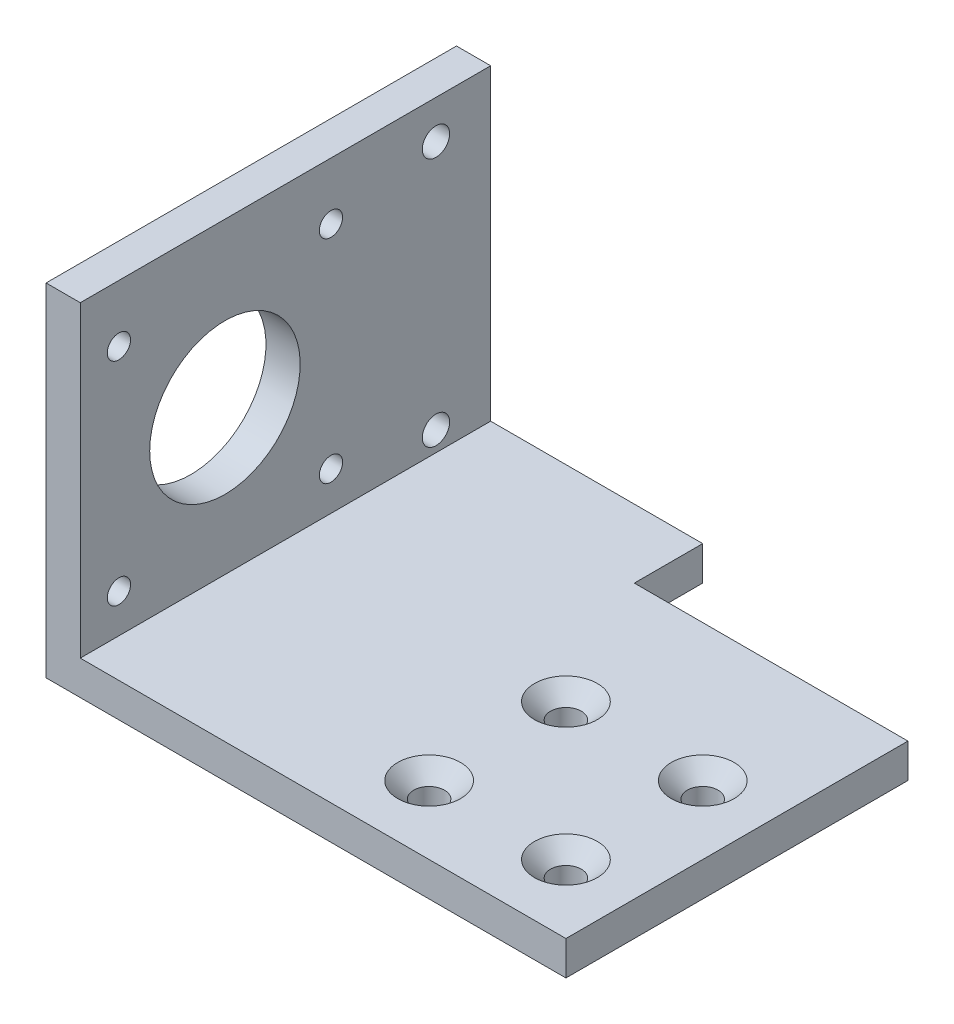
ISO-10303-21;
HEADER;
FILE_DESCRIPTION(('STEP AP214'),'2;1');
FILE_NAME('part.step','',(''),(''),'','','');
FILE_SCHEMA(('AUTOMOTIVE_DESIGN { 1 0 10303 214 1 1 1 1 }'));
ENDSEC;
DATA;
#1=APPLICATION_CONTEXT('core data for automotive mechanical design processes');
#2=APPLICATION_PROTOCOL_DEFINITION('international standard','automotive_design',2000,#1);
#3=PRODUCT_CONTEXT('',#1,'mechanical');
#4=PRODUCT('Part','Part','',(#3));
#5=PRODUCT_RELATED_PRODUCT_CATEGORY('part','',(#4));
#6=PRODUCT_DEFINITION_FORMATION('','',#4);
#7=PRODUCT_DEFINITION_CONTEXT('part definition',#1,'design');
#8=PRODUCT_DEFINITION('design','',#6,#7);
#9=PRODUCT_DEFINITION_SHAPE('','',#8);
#10=(LENGTH_UNIT() NAMED_UNIT(*) SI_UNIT(.MILLI.,.METRE.));
#11=(NAMED_UNIT(*) PLANE_ANGLE_UNIT() SI_UNIT($,.RADIAN.));
#12=(NAMED_UNIT(*) SI_UNIT($,.STERADIAN.) SOLID_ANGLE_UNIT());
#13=UNCERTAINTY_MEASURE_WITH_UNIT(LENGTH_MEASURE(1.E-05),#10,'distance_accuracy_value','');
#14=(GEOMETRIC_REPRESENTATION_CONTEXT(3) GLOBAL_UNCERTAINTY_ASSIGNED_CONTEXT((#13)) GLOBAL_UNIT_ASSIGNED_CONTEXT((#10,
#11,#12)) REPRESENTATION_CONTEXT('',''));
#15=CARTESIAN_POINT('',(0.,0.,0.));
#16=DIRECTION('',(0.,0.,1.));
#17=DIRECTION('',(1.,0.,0.));
#18=AXIS2_PLACEMENT_3D('',#15,#16,#17);
#19=CARTESIAN_POINT('',(10.,7.9,8.));
#20=DIRECTION('',(-1.,0.,0.));
#21=DIRECTION('',(0.,0.,1.));
#22=AXIS2_PLACEMENT_3D('',#19,#20,#21);
#23=CYLINDRICAL_SURFACE('',#22,2.);
#24=CARTESIAN_POINT('',(5.,7.9,8.));
#25=DIRECTION('',(-1.,0.,0.));
#26=DIRECTION('',(0.,-1.,0.));
#27=AXIS2_PLACEMENT_3D('',#24,#25,#26);
#28=CIRCLE('',#27,2.);
#29=CARTESIAN_POINT('',(5.,5.9,8.));
#30=VERTEX_POINT('',#29);
#31=EDGE_CURVE('E159',#30,#30,#28,.T.);
#32=ORIENTED_EDGE('',*,*,#31,.F.);
#33=EDGE_LOOP('',(#32));
#34=FACE_BOUND('',#33,.T.);
#35=CARTESIAN_POINT('',(2.,7.9,8.));
#36=DIRECTION('',(-1.,0.,0.));
#37=DIRECTION('',(0.,0.,1.));
#38=AXIS2_PLACEMENT_3D('',#35,#36,#37);
#39=CIRCLE('',#38,2.);
#40=CARTESIAN_POINT('',(2.,7.9,10.));
#41=VERTEX_POINT('',#40);
#42=EDGE_CURVE('E165',#41,#41,#39,.F.);
#43=ORIENTED_EDGE('',*,*,#42,.F.);
#44=EDGE_LOOP('',(#43));
#45=FACE_BOUND('',#44,.T.);
#46=ADVANCED_FACE('F36',(#34,#45),#23,.F.);
#47=CARTESIAN_POINT('',(10.,44.4,8.));
#48=DIRECTION('',(-1.,0.,0.));
#49=DIRECTION('',(0.,0.,1.));
#50=AXIS2_PLACEMENT_3D('',#47,#48,#49);
#51=CYLINDRICAL_SURFACE('',#50,2.);
#52=CARTESIAN_POINT('',(5.,44.4,8.));
#53=DIRECTION('',(-1.,0.,0.));
#54=DIRECTION('',(0.,-1.,0.));
#55=AXIS2_PLACEMENT_3D('',#52,#53,#54);
#56=CIRCLE('',#55,2.);
#57=CARTESIAN_POINT('',(5.,42.4,8.));
#58=VERTEX_POINT('',#57);
#59=EDGE_CURVE('E156',#58,#58,#56,.T.);
#60=ORIENTED_EDGE('',*,*,#59,.F.);
#61=EDGE_LOOP('',(#60));
#62=FACE_BOUND('',#61,.T.);
#63=CARTESIAN_POINT('',(2.,44.4,8.));
#64=DIRECTION('',(-1.,0.,0.));
#65=DIRECTION('',(0.,0.,1.));
#66=AXIS2_PLACEMENT_3D('',#63,#64,#65);
#67=CIRCLE('',#66,2.);
#68=CARTESIAN_POINT('',(2.,44.4,10.));
#69=VERTEX_POINT('',#68);
#70=EDGE_CURVE('E162',#69,#69,#67,.F.);
#71=ORIENTED_EDGE('',*,*,#70,.F.);
#72=EDGE_LOOP('',(#71));
#73=FACE_BOUND('',#72,.T.);
#74=ADVANCED_FACE('F252',(#62,#73),#51,.F.);
#75=CARTESIAN_POINT('',(0.,0.,60.));
#76=DIRECTION('',(1.,0.,0.));
#77=DIRECTION('',(0.,0.,-1.));
#78=AXIS2_PLACEMENT_3D('',#75,#76,#77);
#79=PLANE('',#78);
#80=CARTESIAN_POINT('',(0.,7.9,8.));
#81=DIRECTION('',(-1.,0.,0.));
#82=DIRECTION('',(0.,0.,1.));
#83=AXIS2_PLACEMENT_3D('',#80,#81,#82);
#84=CIRCLE('',#83,3.);
#85=CARTESIAN_POINT('',(0.,7.9,11.));
#86=VERTEX_POINT('',#85);
#87=EDGE_CURVE('E174',#86,#86,#84,.T.);
#88=ORIENTED_EDGE('',*,*,#87,.F.);
#89=EDGE_LOOP('',(#88));
#90=FACE_BOUND('',#89,.T.);
#91=CARTESIAN_POINT('',(0.,44.4,8.));
#92=DIRECTION('',(-1.,0.,0.));
#93=DIRECTION('',(0.,0.,1.));
#94=AXIS2_PLACEMENT_3D('',#91,#92,#93);
#95=CIRCLE('',#94,3.);
#96=CARTESIAN_POINT('',(0.,44.4,11.));
#97=VERTEX_POINT('',#96);
#98=EDGE_CURVE('E167',#97,#97,#95,.T.);
#99=ORIENTED_EDGE('',*,*,#98,.F.);
#100=EDGE_LOOP('',(#99));
#101=FACE_BOUND('',#100,.T.);
#102=CARTESIAN_POINT('',(0.,10.65,23.35));
#103=DIRECTION('',(-1.,0.,0.));
#104=DIRECTION('',(0.,0.,1.));
#105=AXIS2_PLACEMENT_3D('',#102,#103,#104);
#106=CIRCLE('',#105,3.47);
#107=CARTESIAN_POINT('',(0.,10.65,26.82));
#108=VERTEX_POINT('',#107);
#109=EDGE_CURVE('E218',#108,#108,#106,.T.);
#110=ORIENTED_EDGE('',*,*,#109,.F.);
#111=EDGE_LOOP('',(#110));
#112=FACE_BOUND('',#111,.T.);
#113=CARTESIAN_POINT('',(0.,26.15,38.85));
#114=DIRECTION('',(-1.,0.,0.));
#115=DIRECTION('',(0.,0.,1.));
#116=AXIS2_PLACEMENT_3D('',#113,#114,#115);
#117=CIRCLE('',#116,11.);
#118=CARTESIAN_POINT('',(0.,26.15,49.85));
#119=VERTEX_POINT('',#118);
#120=EDGE_CURVE('E226',#119,#119,#117,.T.);
#121=ORIENTED_EDGE('',*,*,#120,.F.);
#122=EDGE_LOOP('',(#121));
#123=FACE_BOUND('',#122,.T.);
#124=DIRECTION('',(0.,-1.,0.));
#125=VECTOR('',#124,1.);
#126=CARTESIAN_POINT('',(0.,0.,0.));
#127=LINE('',#126,#125);
#128=CARTESIAN_POINT('',(0.,50.,0.));
#129=VERTEX_POINT('',#128);
#130=CARTESIAN_POINT('',(0.,0.,0.));
#131=VERTEX_POINT('',#130);
#132=EDGE_CURVE('E120',#129,#131,#127,.T.);
#133=ORIENTED_EDGE('',*,*,#132,.T.);
#134=DIRECTION('',(0.,0.,-1.));
#135=VECTOR('',#134,1.);
#136=CARTESIAN_POINT('',(0.,0.,60.));
#137=LINE('',#136,#135);
#138=CARTESIAN_POINT('',(0.,0.,60.));
#139=VERTEX_POINT('',#138);
#140=EDGE_CURVE('E134',#139,#131,#137,.T.);
#141=ORIENTED_EDGE('',*,*,#140,.F.);
#142=DIRECTION('',(0.,-1.,0.));
#143=VECTOR('',#142,1.);
#144=CARTESIAN_POINT('',(0.,0.,60.));
#145=LINE('',#144,#143);
#146=CARTESIAN_POINT('',(0.,50.,60.));
#147=VERTEX_POINT('',#146);
#148=EDGE_CURVE('E117',#147,#139,#145,.T.);
#149=ORIENTED_EDGE('',*,*,#148,.F.);
#150=DIRECTION('',(0.,0.,-1.));
#151=VECTOR('',#150,1.);
#152=CARTESIAN_POINT('',(0.,50.,60.));
#153=LINE('',#152,#151);
#154=EDGE_CURVE('E144',#147,#129,#153,.T.);
#155=ORIENTED_EDGE('',*,*,#154,.T.);
#156=EDGE_LOOP('',(#133,#141,#149,#155));
#157=FACE_BOUND('',#156,.T.);
#158=CARTESIAN_POINT('',(0.,41.65,23.35));
#159=DIRECTION('',(-1.,0.,0.));
#160=DIRECTION('',(0.,0.,1.));
#161=AXIS2_PLACEMENT_3D('',#158,#159,#160);
#162=CIRCLE('',#161,3.47);
#163=CARTESIAN_POINT('',(0.,41.65,26.82));
#164=VERTEX_POINT('',#163);
#165=EDGE_CURVE('E209',#164,#164,#162,.T.);
#166=ORIENTED_EDGE('',*,*,#165,.F.);
#167=EDGE_LOOP('',(#166));
#168=FACE_BOUND('',#167,.T.);
#169=CARTESIAN_POINT('',(0.,41.65,54.35));
#170=DIRECTION('',(-1.,0.,0.));
#171=DIRECTION('',(0.,0.,1.));
#172=AXIS2_PLACEMENT_3D('',#169,#170,#171);
#173=CIRCLE('',#172,3.47);
#174=CARTESIAN_POINT('',(0.,41.65,57.82));
#175=VERTEX_POINT('',#174);
#176=EDGE_CURVE('E200',#175,#175,#173,.T.);
#177=ORIENTED_EDGE('',*,*,#176,.F.);
#178=EDGE_LOOP('',(#177));
#179=FACE_BOUND('',#178,.T.);
#180=CARTESIAN_POINT('',(0.,10.65,54.35));
#181=DIRECTION('',(-1.,0.,0.));
#182=DIRECTION('',(0.,0.,1.));
#183=AXIS2_PLACEMENT_3D('',#180,#181,#182);
#184=CIRCLE('',#183,3.47);
#185=CARTESIAN_POINT('',(0.,10.65,57.82));
#186=VERTEX_POINT('',#185);
#187=EDGE_CURVE('E191',#186,#186,#184,.T.);
#188=ORIENTED_EDGE('',*,*,#187,.F.);
#189=EDGE_LOOP('',(#188));
#190=FACE_BOUND('',#189,.T.);
#191=ADVANCED_FACE('F258',(#90,#101,#112,#123,#157,#168,#179,#190),#79,.F.);
#192=CARTESIAN_POINT('',(100.,0.,60.));
#193=DIRECTION('',(0.,1.,0.));
#194=DIRECTION('',(-1.,0.,0.));
#195=AXIS2_PLACEMENT_3D('',#192,#193,#194);
#196=PLANE('',#195);
#197=CARTESIAN_POINT('',(46.,0.,30.));
#198=DIRECTION('',(0.,1.,0.));
#199=DIRECTION('',(0.,0.,1.));
#200=AXIS2_PLACEMENT_3D('',#197,#198,#199);
#201=CIRCLE('',#200,2.25);
#202=CARTESIAN_POINT('',(46.,0.,32.25));
#203=VERTEX_POINT('',#202);
#204=EDGE_CURVE('E511',#203,#203,#201,.T.);
#205=ORIENTED_EDGE('',*,*,#204,.T.);
#206=EDGE_LOOP('',(#205));
#207=FACE_BOUND('',#206,.T.);
#208=CARTESIAN_POINT('',(66.,0.,30.));
#209=DIRECTION('',(0.,1.,0.));
#210=DIRECTION('',(0.,0.,1.));
#211=AXIS2_PLACEMENT_3D('',#208,#209,#210);
#212=CIRCLE('',#211,2.25);
#213=CARTESIAN_POINT('',(66.,0.,32.25));
#214=VERTEX_POINT('',#213);
#215=EDGE_CURVE('E520',#214,#214,#212,.T.);
#216=ORIENTED_EDGE('',*,*,#215,.T.);
#217=EDGE_LOOP('',(#216));
#218=FACE_BOUND('',#217,.T.);
#219=CARTESIAN_POINT('',(46.,0.,50.));
#220=DIRECTION('',(0.,1.,0.));
#221=DIRECTION('',(0.,0.,1.));
#222=AXIS2_PLACEMENT_3D('',#219,#220,#221);
#223=CIRCLE('',#222,2.25);
#224=CARTESIAN_POINT('',(46.,0.,52.25));
#225=VERTEX_POINT('',#224);
#226=EDGE_CURVE('E369',#225,#225,#223,.T.);
#227=ORIENTED_EDGE('',*,*,#226,.T.);
#228=EDGE_LOOP('',(#227));
#229=FACE_BOUND('',#228,.T.);
#230=CARTESIAN_POINT('',(66.,0.,50.));
#231=DIRECTION('',(0.,1.,0.));
#232=DIRECTION('',(0.,0.,1.));
#233=AXIS2_PLACEMENT_3D('',#230,#231,#232);
#234=CIRCLE('',#233,2.25);
#235=CARTESIAN_POINT('',(66.,0.,52.25));
#236=VERTEX_POINT('',#235);
#237=EDGE_CURVE('E113',#236,#236,#234,.T.);
#238=ORIENTED_EDGE('',*,*,#237,.T.);
#239=EDGE_LOOP('',(#238));
#240=FACE_BOUND('',#239,.T.);
#241=DIRECTION('',(-1.,0.,0.));
#242=VECTOR('',#241,1.);
#243=CARTESIAN_POINT('',(100.,0.,10.));
#244=LINE('',#243,#242);
#245=CARTESIAN_POINT('',(76.,0.,10.));
#246=VERTEX_POINT('',#245);
#247=CARTESIAN_POINT('',(36.,0.,9.99999999999999));
#248=VERTEX_POINT('',#247);
#249=EDGE_CURVE('E112',#246,#248,#244,.T.);
#250=ORIENTED_EDGE('',*,*,#249,.F.);
#251=DIRECTION('',(0.,0.,-1.));
#252=VECTOR('',#251,1.);
#253=CARTESIAN_POINT('',(76.,0.,10.));
#254=LINE('',#253,#252);
#255=CARTESIAN_POINT('',(76.,0.,60.));
#256=VERTEX_POINT('',#255);
#257=EDGE_CURVE('E51',#256,#246,#254,.T.);
#258=ORIENTED_EDGE('',*,*,#257,.F.);
#259=DIRECTION('',(1.,0.,0.));
#260=VECTOR('',#259,1.);
#261=CARTESIAN_POINT('',(100.,0.,60.));
#262=LINE('',#261,#260);
#263=EDGE_CURVE('E111',#139,#256,#262,.T.);
#264=ORIENTED_EDGE('',*,*,#263,.F.);
#265=ORIENTED_EDGE('',*,*,#140,.T.);
#266=DIRECTION('',(1.,0.,0.));
#267=VECTOR('',#266,1.);
#268=CARTESIAN_POINT('',(100.,0.,0.));
#269=LINE('',#268,#267);
#270=CARTESIAN_POINT('',(36.,0.,0.));
#271=VERTEX_POINT('',#270);
#272=EDGE_CURVE('E135',#131,#271,#269,.T.);
#273=ORIENTED_EDGE('',*,*,#272,.T.);
#274=DIRECTION('',(0.,0.,-1.));
#275=VECTOR('',#274,1.);
#276=CARTESIAN_POINT('',(36.,0.,0.));
#277=LINE('',#276,#275);
#278=EDGE_CURVE('E58',#248,#271,#277,.T.);
#279=ORIENTED_EDGE('',*,*,#278,.F.);
#280=EDGE_LOOP('',(#250,#258,#264,#265,#273,#279));
#281=FACE_BOUND('',#280,.T.);
#282=ADVANCED_FACE('F38',(#207,#218,#229,#240,#281),#196,.F.);
#283=CARTESIAN_POINT('',(5.,4.99999999999999,60.));
#284=DIRECTION('',(0.,-1.,0.));
#285=DIRECTION('',(1.,0.,0.));
#286=AXIS2_PLACEMENT_3D('',#283,#284,#285);
#287=PLANE('',#286);
#288=CARTESIAN_POINT('',(46.,4.99999999999999,30.));
#289=DIRECTION('',(0.,1.,0.));
#290=DIRECTION('',(0.,0.,1.));
#291=AXIS2_PLACEMENT_3D('',#288,#289,#290);
#292=CIRCLE('',#291,4.59);
#293=CARTESIAN_POINT('',(46.,4.99999999999999,34.59));
#294=VERTEX_POINT('',#293);
#295=EDGE_CURVE('E355',#294,#294,#292,.T.);
#296=ORIENTED_EDGE('',*,*,#295,.F.);
#297=EDGE_LOOP('',(#296));
#298=FACE_BOUND('',#297,.T.);
#299=CARTESIAN_POINT('',(66.,4.99999999999999,30.));
#300=DIRECTION('',(0.,1.,0.));
#301=DIRECTION('',(0.,0.,1.));
#302=AXIS2_PLACEMENT_3D('',#299,#300,#301);
#303=CIRCLE('',#302,4.59);
#304=CARTESIAN_POINT('',(66.,4.99999999999999,34.59));
#305=VERTEX_POINT('',#304);
#306=EDGE_CURVE('E359',#305,#305,#303,.T.);
#307=ORIENTED_EDGE('',*,*,#306,.F.);
#308=EDGE_LOOP('',(#307));
#309=FACE_BOUND('',#308,.T.);
#310=CARTESIAN_POINT('',(46.,4.99999999999999,50.));
#311=DIRECTION('',(0.,1.,0.));
#312=DIRECTION('',(0.,0.,1.));
#313=AXIS2_PLACEMENT_3D('',#310,#311,#312);
#314=CIRCLE('',#313,4.59);
#315=CARTESIAN_POINT('',(46.,4.99999999999999,54.59));
#316=VERTEX_POINT('',#315);
#317=EDGE_CURVE('E363',#316,#316,#314,.T.);
#318=ORIENTED_EDGE('',*,*,#317,.F.);
#319=EDGE_LOOP('',(#318));
#320=FACE_BOUND('',#319,.T.);
#321=CARTESIAN_POINT('',(66.,4.99999999999999,50.));
#322=DIRECTION('',(0.,1.,0.));
#323=DIRECTION('',(0.,0.,1.));
#324=AXIS2_PLACEMENT_3D('',#321,#322,#323);
#325=CIRCLE('',#324,4.59);
#326=CARTESIAN_POINT('',(66.,4.99999999999999,54.59));
#327=VERTEX_POINT('',#326);
#328=EDGE_CURVE('E366',#327,#327,#325,.T.);
#329=ORIENTED_EDGE('',*,*,#328,.F.);
#330=EDGE_LOOP('',(#329));
#331=FACE_BOUND('',#330,.T.);
#332=DIRECTION('',(-1.,0.,0.));
#333=VECTOR('',#332,1.);
#334=CARTESIAN_POINT('',(5.,4.99999999999999,60.));
#335=LINE('',#334,#333);
#336=CARTESIAN_POINT('',(76.,4.99999999999999,60.));
#337=VERTEX_POINT('',#336);
#338=CARTESIAN_POINT('',(5.,4.99999999999999,60.));
#339=VERTEX_POINT('',#338);
#340=EDGE_CURVE('E119',#337,#339,#335,.T.);
#341=ORIENTED_EDGE('',*,*,#340,.F.);
#342=DIRECTION('',(0.,0.,-1.));
#343=VECTOR('',#342,1.);
#344=CARTESIAN_POINT('',(76.,4.99999999999999,60.));
#345=LINE('',#344,#343);
#346=CARTESIAN_POINT('',(76.,4.99999999999999,10.));
#347=VERTEX_POINT('',#346);
#348=EDGE_CURVE('E102',#337,#347,#345,.T.);
#349=ORIENTED_EDGE('',*,*,#348,.T.);
#350=DIRECTION('',(-1.,0.,0.));
#351=VECTOR('',#350,1.);
#352=CARTESIAN_POINT('',(5.00000000000001,4.99999999999999,9.99999999999999));
#353=LINE('',#352,#351);
#354=CARTESIAN_POINT('',(36.,4.99999999999999,9.99999999999999));
#355=VERTEX_POINT('',#354);
#356=EDGE_CURVE('E44',#347,#355,#353,.T.);
#357=ORIENTED_EDGE('',*,*,#356,.T.);
#358=DIRECTION('',(0.,0.,-1.));
#359=VECTOR('',#358,1.);
#360=CARTESIAN_POINT('',(36.,4.99999999999999,60.));
#361=LINE('',#360,#359);
#362=CARTESIAN_POINT('',(36.,4.99999999999999,0.));
#363=VERTEX_POINT('',#362);
#364=EDGE_CURVE('E188',#355,#363,#361,.T.);
#365=ORIENTED_EDGE('',*,*,#364,.T.);
#366=DIRECTION('',(-1.,0.,0.));
#367=VECTOR('',#366,1.);
#368=CARTESIAN_POINT('',(5.,4.99999999999999,0.));
#369=LINE('',#368,#367);
#370=CARTESIAN_POINT('',(5.,4.99999999999999,0.));
#371=VERTEX_POINT('',#370);
#372=EDGE_CURVE('E138',#363,#371,#369,.T.);
#373=ORIENTED_EDGE('',*,*,#372,.T.);
#374=DIRECTION('',(0.,0.,-1.));
#375=VECTOR('',#374,1.);
#376=CARTESIAN_POINT('',(5.,4.99999999999999,60.));
#377=LINE('',#376,#375);
#378=EDGE_CURVE('E150',#339,#371,#377,.T.);
#379=ORIENTED_EDGE('',*,*,#378,.F.);
#380=EDGE_LOOP('',(#341,#349,#357,#365,#373,#379));
#381=FACE_BOUND('',#380,.T.);
#382=ADVANCED_FACE('F330',(#298,#309,#320,#331,#381),#287,.F.);
#383=CARTESIAN_POINT('',(5.,50.,60.));
#384=DIRECTION('',(-1.,0.,0.));
#385=DIRECTION('',(0.,-1.,0.));
#386=AXIS2_PLACEMENT_3D('',#383,#384,#385);
#387=PLANE('',#386);
#388=ORIENTED_EDGE('',*,*,#31,.T.);
#389=EDGE_LOOP('',(#388));
#390=FACE_BOUND('',#389,.T.);
#391=ORIENTED_EDGE('',*,*,#59,.T.);
#392=EDGE_LOOP('',(#391));
#393=FACE_BOUND('',#392,.T.);
#394=CARTESIAN_POINT('',(5.,10.65,54.35));
#395=DIRECTION('',(-1.,0.,0.));
#396=DIRECTION('',(0.,-1.,0.));
#397=AXIS2_PLACEMENT_3D('',#394,#395,#396);
#398=CIRCLE('',#397,1.69999999999999);
#399=CARTESIAN_POINT('',(5.,8.95000000000001,54.35));
#400=VERTEX_POINT('',#399);
#401=EDGE_CURVE('E197',#400,#400,#398,.T.);
#402=ORIENTED_EDGE('',*,*,#401,.T.);
#403=EDGE_LOOP('',(#402));
#404=FACE_BOUND('',#403,.T.);
#405=CARTESIAN_POINT('',(5.,41.65,54.35));
#406=DIRECTION('',(-1.,0.,0.));
#407=DIRECTION('',(0.,-1.,0.));
#408=AXIS2_PLACEMENT_3D('',#405,#406,#407);
#409=CIRCLE('',#408,1.69999999999999);
#410=CARTESIAN_POINT('',(5.,39.95,54.35));
#411=VERTEX_POINT('',#410);
#412=EDGE_CURVE('E206',#411,#411,#409,.T.);
#413=ORIENTED_EDGE('',*,*,#412,.T.);
#414=EDGE_LOOP('',(#413));
#415=FACE_BOUND('',#414,.T.);
#416=CARTESIAN_POINT('',(5.,41.65,23.35));
#417=DIRECTION('',(-1.,0.,0.));
#418=DIRECTION('',(0.,-1.,0.));
#419=AXIS2_PLACEMENT_3D('',#416,#417,#418);
#420=CIRCLE('',#419,1.69999999999999);
#421=CARTESIAN_POINT('',(5.,39.95,23.35));
#422=VERTEX_POINT('',#421);
#423=EDGE_CURVE('E215',#422,#422,#420,.T.);
#424=ORIENTED_EDGE('',*,*,#423,.T.);
#425=EDGE_LOOP('',(#424));
#426=FACE_BOUND('',#425,.T.);
#427=CARTESIAN_POINT('',(5.,10.65,23.35));
#428=DIRECTION('',(-1.,0.,0.));
#429=DIRECTION('',(0.,-1.,0.));
#430=AXIS2_PLACEMENT_3D('',#427,#428,#429);
#431=CIRCLE('',#430,1.69999999999999);
#432=CARTESIAN_POINT('',(5.,8.95000000000001,23.35));
#433=VERTEX_POINT('',#432);
#434=EDGE_CURVE('E224',#433,#433,#431,.T.);
#435=ORIENTED_EDGE('',*,*,#434,.T.);
#436=EDGE_LOOP('',(#435));
#437=FACE_BOUND('',#436,.T.);
#438=CARTESIAN_POINT('',(5.,26.15,38.85));
#439=DIRECTION('',(-1.,0.,0.));
#440=DIRECTION('',(0.,-1.,0.));
#441=AXIS2_PLACEMENT_3D('',#438,#439,#440);
#442=CIRCLE('',#441,11.);
#443=CARTESIAN_POINT('',(5.,15.15,38.85));
#444=VERTEX_POINT('',#443);
#445=EDGE_CURVE('E127',#444,#444,#442,.T.);
#446=ORIENTED_EDGE('',*,*,#445,.T.);
#447=EDGE_LOOP('',(#446));
#448=FACE_BOUND('',#447,.T.);
#449=DIRECTION('',(0.,1.,0.));
#450=VECTOR('',#449,1.);
#451=CARTESIAN_POINT('',(5.,50.,0.));
#452=LINE('',#451,#450);
#453=CARTESIAN_POINT('',(5.,50.,0.));
#454=VERTEX_POINT('',#453);
#455=EDGE_CURVE('E140',#371,#454,#452,.T.);
#456=ORIENTED_EDGE('',*,*,#455,.T.);
#457=DIRECTION('',(0.,0.,-1.));
#458=VECTOR('',#457,1.);
#459=CARTESIAN_POINT('',(5.,50.,60.));
#460=LINE('',#459,#458);
#461=CARTESIAN_POINT('',(5.,50.,60.));
#462=VERTEX_POINT('',#461);
#463=EDGE_CURVE('E147',#462,#454,#460,.T.);
#464=ORIENTED_EDGE('',*,*,#463,.F.);
#465=DIRECTION('',(0.,1.,0.));
#466=VECTOR('',#465,1.);
#467=CARTESIAN_POINT('',(5.,50.,60.));
#468=LINE('',#467,#466);
#469=EDGE_CURVE('E122',#339,#462,#468,.T.);
#470=ORIENTED_EDGE('',*,*,#469,.F.);
#471=ORIENTED_EDGE('',*,*,#378,.T.);
#472=EDGE_LOOP('',(#456,#464,#470,#471));
#473=FACE_BOUND('',#472,.T.);
#474=ADVANCED_FACE('F233',(#390,#393,#404,#415,#426,#437,#448,#473),#387,.F.);
#475=CARTESIAN_POINT('',(0.,50.,60.));
#476=DIRECTION('',(0.,-1.,0.));
#477=DIRECTION('',(0.,0.,-1.));
#478=AXIS2_PLACEMENT_3D('',#475,#476,#477);
#479=PLANE('',#478);
#480=DIRECTION('',(-1.,0.,0.));
#481=VECTOR('',#480,1.);
#482=CARTESIAN_POINT('',(0.,50.,0.));
#483=LINE('',#482,#481);
#484=EDGE_CURVE('E124',#454,#129,#483,.T.);
#485=ORIENTED_EDGE('',*,*,#484,.T.);
#486=ORIENTED_EDGE('',*,*,#154,.F.);
#487=DIRECTION('',(-1.,0.,0.));
#488=VECTOR('',#487,1.);
#489=CARTESIAN_POINT('',(0.,50.,60.));
#490=LINE('',#489,#488);
#491=EDGE_CURVE('E131',#462,#147,#490,.T.);
#492=ORIENTED_EDGE('',*,*,#491,.F.);
#493=ORIENTED_EDGE('',*,*,#463,.T.);
#494=EDGE_LOOP('',(#485,#486,#492,#493));
#495=FACE_BOUND('',#494,.T.);
#496=ADVANCED_FACE('F337',(#495),#479,.F.);
#497=CARTESIAN_POINT('',(0.,0.,60.));
#498=DIRECTION('',(0.,0.,-1.));
#499=DIRECTION('',(-1.,0.,0.));
#500=AXIS2_PLACEMENT_3D('',#497,#498,#499);
#501=PLANE('',#500);
#502=ORIENTED_EDGE('',*,*,#263,.T.);
#503=DIRECTION('',(0.,-1.,0.));
#504=VECTOR('',#503,1.);
#505=CARTESIAN_POINT('',(76.,50.,60.));
#506=LINE('',#505,#504);
#507=EDGE_CURVE('E99',#337,#256,#506,.T.);
#508=ORIENTED_EDGE('',*,*,#507,.F.);
#509=ORIENTED_EDGE('',*,*,#340,.T.);
#510=ORIENTED_EDGE('',*,*,#469,.T.);
#511=ORIENTED_EDGE('',*,*,#491,.T.);
#512=ORIENTED_EDGE('',*,*,#148,.T.);
#513=EDGE_LOOP('',(#502,#508,#509,#510,#511,#512));
#514=FACE_BOUND('',#513,.T.);
#515=ADVANCED_FACE('F115',(#514),#501,.F.);
#516=CARTESIAN_POINT('',(0.,0.,0.));
#517=DIRECTION('',(0.,0.,-1.));
#518=DIRECTION('',(-1.,0.,0.));
#519=AXIS2_PLACEMENT_3D('',#516,#517,#518);
#520=PLANE('',#519);
#521=DIRECTION('',(0.,1.,0.));
#522=VECTOR('',#521,1.);
#523=CARTESIAN_POINT('',(36.,0.,0.));
#524=LINE('',#523,#522);
#525=EDGE_CURVE('E153',#271,#363,#524,.T.);
#526=ORIENTED_EDGE('',*,*,#525,.F.);
#527=ORIENTED_EDGE('',*,*,#272,.F.);
#528=ORIENTED_EDGE('',*,*,#132,.F.);
#529=ORIENTED_EDGE('',*,*,#484,.F.);
#530=ORIENTED_EDGE('',*,*,#455,.F.);
#531=ORIENTED_EDGE('',*,*,#372,.F.);
#532=EDGE_LOOP('',(#526,#527,#528,#529,#530,#531));
#533=FACE_BOUND('',#532,.T.);
#534=ADVANCED_FACE('F239',(#533),#520,.T.);
#535=CARTESIAN_POINT('',(60.,26.15,38.85));
#536=DIRECTION('',(-1.,0.,0.));
#537=DIRECTION('',(0.,0.,1.));
#538=AXIS2_PLACEMENT_3D('',#535,#536,#537);
#539=CYLINDRICAL_SURFACE('',#538,11.);
#540=ORIENTED_EDGE('',*,*,#120,.T.);
#541=EDGE_LOOP('',(#540));
#542=FACE_BOUND('',#541,.T.);
#543=ORIENTED_EDGE('',*,*,#445,.F.);
#544=EDGE_LOOP('',(#543));
#545=FACE_BOUND('',#544,.T.);
#546=ADVANCED_FACE('F236',(#542,#545),#539,.F.);
#547=CARTESIAN_POINT('',(0.,10.65,23.35));
#548=DIRECTION('',(-1.,0.,0.));
#549=DIRECTION('',(0.,0.,1.));
#550=AXIS2_PLACEMENT_3D('',#547,#548,#549);
#551=CYLINDRICAL_SURFACE('',#550,1.69999999999999);
#552=ORIENTED_EDGE('',*,*,#434,.F.);
#553=EDGE_LOOP('',(#552));
#554=FACE_BOUND('',#553,.T.);
#555=CARTESIAN_POINT('',(1.77000000000001,10.65,23.35));
#556=DIRECTION('',(-1.,0.,0.));
#557=DIRECTION('',(0.,0.,1.));
#558=AXIS2_PLACEMENT_3D('',#555,#556,#557);
#559=CIRCLE('',#558,1.69999999999999);
#560=CARTESIAN_POINT('',(1.77000000000001,10.65,25.05));
#561=VERTEX_POINT('',#560);
#562=EDGE_CURVE('E221',#561,#561,#559,.T.);
#563=ORIENTED_EDGE('',*,*,#562,.T.);
#564=EDGE_LOOP('',(#563));
#565=FACE_BOUND('',#564,.T.);
#566=ADVANCED_FACE('F238',(#554,#565),#551,.F.);
#567=CARTESIAN_POINT('',(0.,10.65,23.35));
#568=DIRECTION('',(-1.,0.,0.));
#569=DIRECTION('',(0.,0.,1.));
#570=AXIS2_PLACEMENT_3D('',#567,#568,#569);
#571=CONICAL_SURFACE('',#570,3.47,0.78539816339745);
#572=ORIENTED_EDGE('',*,*,#562,.F.);
#573=EDGE_LOOP('',(#572));
#574=FACE_BOUND('',#573,.T.);
#575=ORIENTED_EDGE('',*,*,#109,.T.);
#576=EDGE_LOOP('',(#575));
#577=FACE_BOUND('',#576,.T.);
#578=ADVANCED_FACE('F245',(#574,#577),#571,.F.);
#579=CARTESIAN_POINT('',(0.,41.65,23.35));
#580=DIRECTION('',(-1.,0.,0.));
#581=DIRECTION('',(0.,0.,1.));
#582=AXIS2_PLACEMENT_3D('',#579,#580,#581);
#583=CYLINDRICAL_SURFACE('',#582,1.69999999999999);
#584=ORIENTED_EDGE('',*,*,#423,.F.);
#585=EDGE_LOOP('',(#584));
#586=FACE_BOUND('',#585,.T.);
#587=CARTESIAN_POINT('',(1.77000000000001,41.65,23.35));
#588=DIRECTION('',(-1.,0.,0.));
#589=DIRECTION('',(0.,0.,1.));
#590=AXIS2_PLACEMENT_3D('',#587,#588,#589);
#591=CIRCLE('',#590,1.69999999999999);
#592=CARTESIAN_POINT('',(1.77000000000001,41.65,25.05));
#593=VERTEX_POINT('',#592);
#594=EDGE_CURVE('E212',#593,#593,#591,.T.);
#595=ORIENTED_EDGE('',*,*,#594,.T.);
#596=EDGE_LOOP('',(#595));
#597=FACE_BOUND('',#596,.T.);
#598=ADVANCED_FACE('F294',(#586,#597),#583,.F.);
#599=CARTESIAN_POINT('',(0.,41.65,23.35));
#600=DIRECTION('',(-1.,0.,0.));
#601=DIRECTION('',(0.,0.,1.));
#602=AXIS2_PLACEMENT_3D('',#599,#600,#601);
#603=CONICAL_SURFACE('',#602,3.47,0.78539816339745);
#604=ORIENTED_EDGE('',*,*,#594,.F.);
#605=EDGE_LOOP('',(#604));
#606=FACE_BOUND('',#605,.T.);
#607=ORIENTED_EDGE('',*,*,#165,.T.);
#608=EDGE_LOOP('',(#607));
#609=FACE_BOUND('',#608,.T.);
#610=ADVANCED_FACE('F290',(#606,#609),#603,.F.);
#611=CARTESIAN_POINT('',(0.,41.65,54.35));
#612=DIRECTION('',(-1.,0.,0.));
#613=DIRECTION('',(0.,0.,1.));
#614=AXIS2_PLACEMENT_3D('',#611,#612,#613);
#615=CYLINDRICAL_SURFACE('',#614,1.69999999999999);
#616=ORIENTED_EDGE('',*,*,#412,.F.);
#617=EDGE_LOOP('',(#616));
#618=FACE_BOUND('',#617,.T.);
#619=CARTESIAN_POINT('',(1.77000000000001,41.65,54.35));
#620=DIRECTION('',(-1.,0.,0.));
#621=DIRECTION('',(0.,0.,1.));
#622=AXIS2_PLACEMENT_3D('',#619,#620,#621);
#623=CIRCLE('',#622,1.69999999999999);
#624=CARTESIAN_POINT('',(1.77000000000001,41.65,56.05));
#625=VERTEX_POINT('',#624);
#626=EDGE_CURVE('E203',#625,#625,#623,.T.);
#627=ORIENTED_EDGE('',*,*,#626,.T.);
#628=EDGE_LOOP('',(#627));
#629=FACE_BOUND('',#628,.T.);
#630=ADVANCED_FACE('F286',(#618,#629),#615,.F.);
#631=CARTESIAN_POINT('',(0.,41.65,54.35));
#632=DIRECTION('',(-1.,0.,0.));
#633=DIRECTION('',(0.,0.,1.));
#634=AXIS2_PLACEMENT_3D('',#631,#632,#633);
#635=CONICAL_SURFACE('',#634,3.47,0.78539816339745);
#636=ORIENTED_EDGE('',*,*,#626,.F.);
#637=EDGE_LOOP('',(#636));
#638=FACE_BOUND('',#637,.T.);
#639=ORIENTED_EDGE('',*,*,#176,.T.);
#640=EDGE_LOOP('',(#639));
#641=FACE_BOUND('',#640,.T.);
#642=ADVANCED_FACE('F282',(#638,#641),#635,.F.);
#643=CARTESIAN_POINT('',(0.,10.65,54.35));
#644=DIRECTION('',(-1.,0.,0.));
#645=DIRECTION('',(0.,0.,1.));
#646=AXIS2_PLACEMENT_3D('',#643,#644,#645);
#647=CYLINDRICAL_SURFACE('',#646,1.69999999999999);
#648=ORIENTED_EDGE('',*,*,#401,.F.);
#649=EDGE_LOOP('',(#648));
#650=FACE_BOUND('',#649,.T.);
#651=CARTESIAN_POINT('',(1.77000000000001,10.65,54.35));
#652=DIRECTION('',(-1.,0.,0.));
#653=DIRECTION('',(0.,0.,1.));
#654=AXIS2_PLACEMENT_3D('',#651,#652,#653);
#655=CIRCLE('',#654,1.69999999999999);
#656=CARTESIAN_POINT('',(1.77000000000001,10.65,56.05));
#657=VERTEX_POINT('',#656);
#658=EDGE_CURVE('E194',#657,#657,#655,.T.);
#659=ORIENTED_EDGE('',*,*,#658,.T.);
#660=EDGE_LOOP('',(#659));
#661=FACE_BOUND('',#660,.T.);
#662=ADVANCED_FACE('F278',(#650,#661),#647,.F.);
#663=CARTESIAN_POINT('',(0.,10.65,54.35));
#664=DIRECTION('',(-1.,0.,0.));
#665=DIRECTION('',(0.,0.,1.));
#666=AXIS2_PLACEMENT_3D('',#663,#664,#665);
#667=CONICAL_SURFACE('',#666,3.47,0.78539816339745);
#668=ORIENTED_EDGE('',*,*,#658,.F.);
#669=EDGE_LOOP('',(#668));
#670=FACE_BOUND('',#669,.T.);
#671=ORIENTED_EDGE('',*,*,#187,.T.);
#672=EDGE_LOOP('',(#671));
#673=FACE_BOUND('',#672,.T.);
#674=ADVANCED_FACE('F274',(#670,#673),#667,.F.);
#675=CARTESIAN_POINT('',(100.,50.,10.));
#676=DIRECTION('',(0.,0.,1.));
#677=DIRECTION('',(1.,0.,0.));
#678=AXIS2_PLACEMENT_3D('',#675,#676,#677);
#679=PLANE('',#678);
#680=ORIENTED_EDGE('',*,*,#356,.F.);
#681=DIRECTION('',(0.,-1.,0.));
#682=VECTOR('',#681,1.);
#683=CARTESIAN_POINT('',(76.,50.,10.));
#684=LINE('',#683,#682);
#685=EDGE_CURVE('E11',#347,#246,#684,.T.);
#686=ORIENTED_EDGE('',*,*,#685,.T.);
#687=ORIENTED_EDGE('',*,*,#249,.T.);
#688=DIRECTION('',(0.,-1.,0.));
#689=VECTOR('',#688,1.);
#690=CARTESIAN_POINT('',(36.,50.,9.99999999999999));
#691=LINE('',#690,#689);
#692=EDGE_CURVE('E186',#355,#248,#691,.T.);
#693=ORIENTED_EDGE('',*,*,#692,.F.);
#694=EDGE_LOOP('',(#680,#686,#687,#693));
#695=FACE_BOUND('',#694,.T.);
#696=ADVANCED_FACE('F271',(#695),#679,.F.);
#697=CARTESIAN_POINT('',(36.,50.,0.));
#698=DIRECTION('',(-1.,0.,0.));
#699=DIRECTION('',(0.,-1.,0.));
#700=AXIS2_PLACEMENT_3D('',#697,#698,#699);
#701=PLANE('',#700);
#702=ORIENTED_EDGE('',*,*,#692,.T.);
#703=ORIENTED_EDGE('',*,*,#278,.T.);
#704=ORIENTED_EDGE('',*,*,#525,.T.);
#705=ORIENTED_EDGE('',*,*,#364,.F.);
#706=EDGE_LOOP('',(#702,#703,#704,#705));
#707=FACE_BOUND('',#706,.T.);
#708=ADVANCED_FACE('F267',(#707),#701,.F.);
#709=CARTESIAN_POINT('',(2.,44.4,8.));
#710=DIRECTION('',(-1.,0.,0.));
#711=DIRECTION('',(0.,0.,1.));
#712=AXIS2_PLACEMENT_3D('',#709,#710,#711);
#713=PLANE('',#712);
#714=CARTESIAN_POINT('',(2.,44.4,8.));
#715=DIRECTION('',(-1.,0.,0.));
#716=DIRECTION('',(0.,0.,1.));
#717=AXIS2_PLACEMENT_3D('',#714,#715,#716);
#718=CIRCLE('',#717,3.);
#719=CARTESIAN_POINT('',(2.,44.4,11.));
#720=VERTEX_POINT('',#719);
#721=EDGE_CURVE('E164',#720,#720,#718,.T.);
#722=ORIENTED_EDGE('',*,*,#721,.T.);
#723=EDGE_LOOP('',(#722));
#724=FACE_BOUND('',#723,.T.);
#725=ORIENTED_EDGE('',*,*,#70,.T.);
#726=EDGE_LOOP('',(#725));
#727=FACE_BOUND('',#726,.T.);
#728=ADVANCED_FACE('F270',(#724,#727),#713,.T.);
#729=CARTESIAN_POINT('',(2.,44.4,8.));
#730=DIRECTION('',(-1.,0.,0.));
#731=DIRECTION('',(0.,0.,1.));
#732=AXIS2_PLACEMENT_3D('',#729,#730,#731);
#733=CYLINDRICAL_SURFACE('',#732,3.);
#734=ORIENTED_EDGE('',*,*,#721,.F.);
#735=EDGE_LOOP('',(#734));
#736=FACE_BOUND('',#735,.T.);
#737=ORIENTED_EDGE('',*,*,#98,.T.);
#738=EDGE_LOOP('',(#737));
#739=FACE_BOUND('',#738,.T.);
#740=ADVANCED_FACE('F264',(#736,#739),#733,.F.);
#741=CARTESIAN_POINT('',(2.,7.9,8.));
#742=DIRECTION('',(-1.,0.,0.));
#743=DIRECTION('',(0.,0.,1.));
#744=AXIS2_PLACEMENT_3D('',#741,#742,#743);
#745=PLANE('',#744);
#746=CARTESIAN_POINT('',(2.,7.9,8.));
#747=DIRECTION('',(-1.,0.,0.));
#748=DIRECTION('',(0.,0.,1.));
#749=AXIS2_PLACEMENT_3D('',#746,#747,#748);
#750=CIRCLE('',#749,3.);
#751=CARTESIAN_POINT('',(2.,7.9,11.));
#752=VERTEX_POINT('',#751);
#753=EDGE_CURVE('E168',#752,#752,#750,.T.);
#754=ORIENTED_EDGE('',*,*,#753,.T.);
#755=EDGE_LOOP('',(#754));
#756=FACE_BOUND('',#755,.T.);
#757=ORIENTED_EDGE('',*,*,#42,.T.);
#758=EDGE_LOOP('',(#757));
#759=FACE_BOUND('',#758,.T.);
#760=ADVANCED_FACE('F403',(#756,#759),#745,.T.);
#761=CARTESIAN_POINT('',(2.,7.9,8.));
#762=DIRECTION('',(-1.,0.,0.));
#763=DIRECTION('',(0.,0.,1.));
#764=AXIS2_PLACEMENT_3D('',#761,#762,#763);
#765=CYLINDRICAL_SURFACE('',#764,3.);
#766=ORIENTED_EDGE('',*,*,#753,.F.);
#767=EDGE_LOOP('',(#766));
#768=FACE_BOUND('',#767,.T.);
#769=ORIENTED_EDGE('',*,*,#87,.T.);
#770=EDGE_LOOP('',(#769));
#771=FACE_BOUND('',#770,.T.);
#772=ADVANCED_FACE('F402',(#768,#771),#765,.F.);
#773=CARTESIAN_POINT('',(76.,50.,10.));
#774=DIRECTION('',(-1.,0.,0.));
#775=DIRECTION('',(0.,-1.,0.));
#776=AXIS2_PLACEMENT_3D('',#773,#774,#775);
#777=PLANE('',#776);
#778=ORIENTED_EDGE('',*,*,#507,.T.);
#779=ORIENTED_EDGE('',*,*,#257,.T.);
#780=ORIENTED_EDGE('',*,*,#685,.F.);
#781=ORIENTED_EDGE('',*,*,#348,.F.);
#782=EDGE_LOOP('',(#778,#779,#780,#781));
#783=FACE_BOUND('',#782,.T.);
#784=ADVANCED_FACE('F100',(#783),#777,.F.);
#785=CARTESIAN_POINT('',(66.,4.99999999999999,50.));
#786=DIRECTION('',(0.,1.,0.));
#787=DIRECTION('',(0.,0.,1.));
#788=AXIS2_PLACEMENT_3D('',#785,#786,#787);
#789=CYLINDRICAL_SURFACE('',#788,2.25);
#790=ORIENTED_EDGE('',*,*,#237,.F.);
#791=EDGE_LOOP('',(#790));
#792=FACE_BOUND('',#791,.T.);
#793=CARTESIAN_POINT('',(66.,2.65999999999999,50.));
#794=DIRECTION('',(0.,1.,0.));
#795=DIRECTION('',(0.,0.,1.));
#796=AXIS2_PLACEMENT_3D('',#793,#794,#795);
#797=CIRCLE('',#796,2.25);
#798=CARTESIAN_POINT('',(66.,2.65999999999999,52.25));
#799=VERTEX_POINT('',#798);
#800=EDGE_CURVE('E368',#799,#799,#797,.T.);
#801=ORIENTED_EDGE('',*,*,#800,.T.);
#802=EDGE_LOOP('',(#801));
#803=FACE_BOUND('',#802,.T.);
#804=ADVANCED_FACE('F382',(#792,#803),#789,.F.);
#805=CARTESIAN_POINT('',(66.,4.99999999999999,50.));
#806=DIRECTION('',(0.,1.,0.));
#807=DIRECTION('',(0.,0.,1.));
#808=AXIS2_PLACEMENT_3D('',#805,#806,#807);
#809=CONICAL_SURFACE('',#808,4.59,0.785398163397447);
#810=ORIENTED_EDGE('',*,*,#800,.F.);
#811=EDGE_LOOP('',(#810));
#812=FACE_BOUND('',#811,.T.);
#813=ORIENTED_EDGE('',*,*,#328,.T.);
#814=EDGE_LOOP('',(#813));
#815=FACE_BOUND('',#814,.T.);
#816=ADVANCED_FACE('F385',(#812,#815),#809,.F.);
#817=CARTESIAN_POINT('',(46.,4.99999999999999,50.));
#818=DIRECTION('',(0.,1.,0.));
#819=DIRECTION('',(0.,0.,1.));
#820=AXIS2_PLACEMENT_3D('',#817,#818,#819);
#821=CYLINDRICAL_SURFACE('',#820,2.25);
#822=ORIENTED_EDGE('',*,*,#226,.F.);
#823=EDGE_LOOP('',(#822));
#824=FACE_BOUND('',#823,.T.);
#825=CARTESIAN_POINT('',(46.,2.65999999999999,50.));
#826=DIRECTION('',(0.,1.,0.));
#827=DIRECTION('',(0.,0.,1.));
#828=AXIS2_PLACEMENT_3D('',#825,#826,#827);
#829=CIRCLE('',#828,2.25);
#830=CARTESIAN_POINT('',(46.,2.65999999999999,52.25));
#831=VERTEX_POINT('',#830);
#832=EDGE_CURVE('E374',#831,#831,#829,.T.);
#833=ORIENTED_EDGE('',*,*,#832,.T.);
#834=EDGE_LOOP('',(#833));
#835=FACE_BOUND('',#834,.T.);
#836=ADVANCED_FACE('F390',(#824,#835),#821,.F.);
#837=CARTESIAN_POINT('',(46.,4.99999999999999,50.));
#838=DIRECTION('',(0.,1.,0.));
#839=DIRECTION('',(0.,0.,1.));
#840=AXIS2_PLACEMENT_3D('',#837,#838,#839);
#841=CONICAL_SURFACE('',#840,4.59,0.785398163397447);
#842=ORIENTED_EDGE('',*,*,#832,.F.);
#843=EDGE_LOOP('',(#842));
#844=FACE_BOUND('',#843,.T.);
#845=ORIENTED_EDGE('',*,*,#317,.T.);
#846=EDGE_LOOP('',(#845));
#847=FACE_BOUND('',#846,.T.);
#848=ADVANCED_FACE('F395',(#844,#847),#841,.F.);
#849=CARTESIAN_POINT('',(66.,4.99999999999999,30.));
#850=DIRECTION('',(0.,1.,0.));
#851=DIRECTION('',(0.,0.,1.));
#852=AXIS2_PLACEMENT_3D('',#849,#850,#851);
#853=CYLINDRICAL_SURFACE('',#852,2.25);
#854=ORIENTED_EDGE('',*,*,#215,.F.);
#855=EDGE_LOOP('',(#854));
#856=FACE_BOUND('',#855,.T.);
#857=CARTESIAN_POINT('',(66.,2.65999999999999,30.));
#858=DIRECTION('',(0.,1.,0.));
#859=DIRECTION('',(0.,0.,1.));
#860=AXIS2_PLACEMENT_3D('',#857,#858,#859);
#861=CIRCLE('',#860,2.25);
#862=CARTESIAN_POINT('',(66.,2.65999999999999,32.25));
#863=VERTEX_POINT('',#862);
#864=EDGE_CURVE('E517',#863,#863,#861,.T.);
#865=ORIENTED_EDGE('',*,*,#864,.T.);
#866=EDGE_LOOP('',(#865));
#867=FACE_BOUND('',#866,.T.);
#868=ADVANCED_FACE('F463',(#856,#867),#853,.F.);
#869=CARTESIAN_POINT('',(66.,4.99999999999999,30.));
#870=DIRECTION('',(0.,1.,0.));
#871=DIRECTION('',(0.,0.,1.));
#872=AXIS2_PLACEMENT_3D('',#869,#870,#871);
#873=CONICAL_SURFACE('',#872,4.59,0.785398163397447);
#874=ORIENTED_EDGE('',*,*,#864,.F.);
#875=EDGE_LOOP('',(#874));
#876=FACE_BOUND('',#875,.T.);
#877=ORIENTED_EDGE('',*,*,#306,.T.);
#878=EDGE_LOOP('',(#877));
#879=FACE_BOUND('',#878,.T.);
#880=ADVANCED_FACE('F472',(#876,#879),#873,.F.);
#881=CARTESIAN_POINT('',(46.,4.99999999999999,30.));
#882=DIRECTION('',(0.,1.,0.));
#883=DIRECTION('',(0.,0.,1.));
#884=AXIS2_PLACEMENT_3D('',#881,#882,#883);
#885=CYLINDRICAL_SURFACE('',#884,2.25);
#886=ORIENTED_EDGE('',*,*,#204,.F.);
#887=EDGE_LOOP('',(#886));
#888=FACE_BOUND('',#887,.T.);
#889=CARTESIAN_POINT('',(46.,2.65999999999999,30.));
#890=DIRECTION('',(0.,1.,0.));
#891=DIRECTION('',(0.,0.,1.));
#892=AXIS2_PLACEMENT_3D('',#889,#890,#891);
#893=CIRCLE('',#892,2.25);
#894=CARTESIAN_POINT('',(46.,2.65999999999999,32.25));
#895=VERTEX_POINT('',#894);
#896=EDGE_CURVE('E509',#895,#895,#893,.T.);
#897=ORIENTED_EDGE('',*,*,#896,.T.);
#898=EDGE_LOOP('',(#897));
#899=FACE_BOUND('',#898,.T.);
#900=ADVANCED_FACE('F482',(#888,#899),#885,.F.);
#901=CARTESIAN_POINT('',(46.,4.99999999999999,30.));
#902=DIRECTION('',(0.,1.,0.));
#903=DIRECTION('',(0.,0.,1.));
#904=AXIS2_PLACEMENT_3D('',#901,#902,#903);
#905=CONICAL_SURFACE('',#904,4.59,0.785398163397447);
#906=ORIENTED_EDGE('',*,*,#896,.F.);
#907=EDGE_LOOP('',(#906));
#908=FACE_BOUND('',#907,.T.);
#909=ORIENTED_EDGE('',*,*,#295,.T.);
#910=EDGE_LOOP('',(#909));
#911=FACE_BOUND('',#910,.T.);
#912=ADVANCED_FACE('F492',(#908,#911),#905,.F.);
#913=CLOSED_SHELL('',(#46,#74,#191,#282,#382,#474,#496,#515,#534,#546,#566,#578,#598,#610,#630,
#642,#662,#674,#696,#708,#728,#740,#760,#772,#784,#804,#816,#836,#848,#868,#880,#900,#912));
#914=MANIFOLD_SOLID_BREP('B2',#913);
#915=ADVANCED_BREP_SHAPE_REPRESENTATION('',(#18,#914),#14);
#916=SHAPE_DEFINITION_REPRESENTATION(#9,#915);
ENDSEC;
END-ISO-10303-21;
